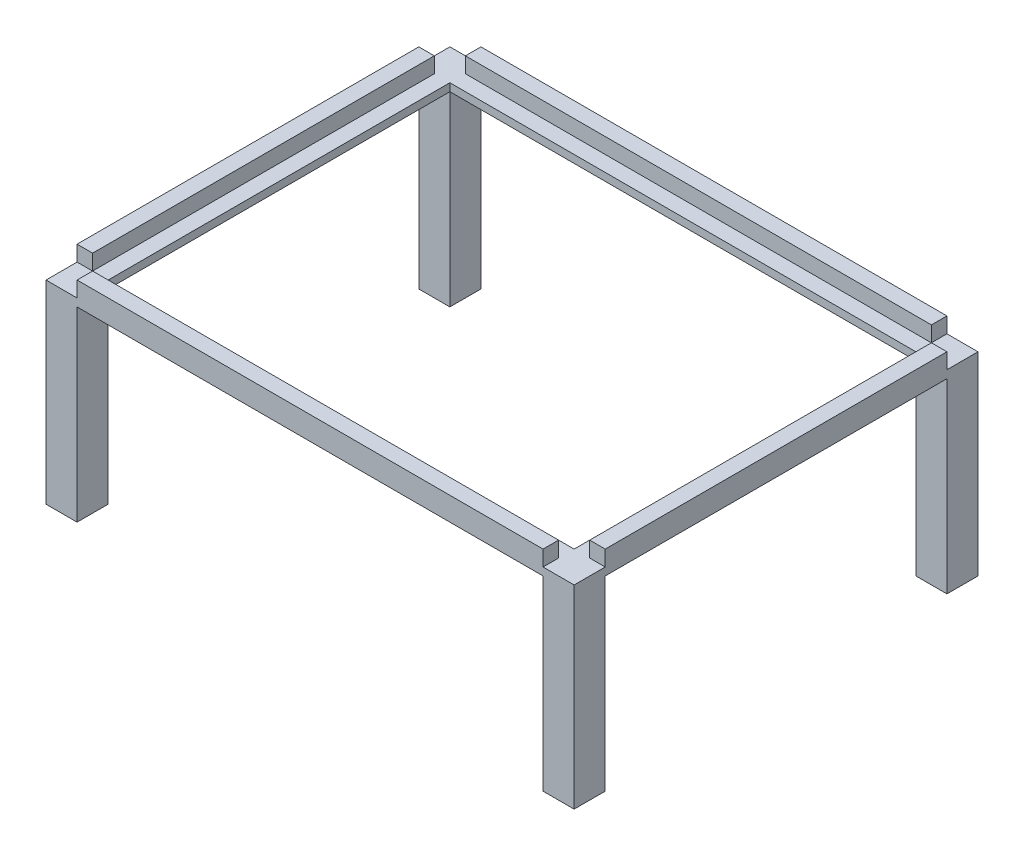
ISO-10303-21;
HEADER;
FILE_DESCRIPTION(('STEP AP214'),'2;1');
FILE_NAME('part.step','',(''),(''),'','','');
FILE_SCHEMA(('AUTOMOTIVE_DESIGN { 1 0 10303 214 1 1 1 1 }'));
ENDSEC;
DATA;
#1=APPLICATION_CONTEXT('core data for automotive mechanical design processes');
#2=APPLICATION_PROTOCOL_DEFINITION('international standard','automotive_design',2000,#1);
#3=PRODUCT_CONTEXT('',#1,'mechanical');
#4=PRODUCT('Part','Part','',(#3));
#5=PRODUCT_RELATED_PRODUCT_CATEGORY('part','',(#4));
#6=PRODUCT_DEFINITION_FORMATION('','',#4);
#7=PRODUCT_DEFINITION_CONTEXT('part definition',#1,'design');
#8=PRODUCT_DEFINITION('design','',#6,#7);
#9=PRODUCT_DEFINITION_SHAPE('','',#8);
#10=(LENGTH_UNIT() NAMED_UNIT(*) SI_UNIT(.MILLI.,.METRE.));
#11=(NAMED_UNIT(*) PLANE_ANGLE_UNIT() SI_UNIT($,.RADIAN.));
#12=(NAMED_UNIT(*) SI_UNIT($,.STERADIAN.) SOLID_ANGLE_UNIT());
#13=UNCERTAINTY_MEASURE_WITH_UNIT(LENGTH_MEASURE(1.E-05),#10,'distance_accuracy_value','');
#14=(GEOMETRIC_REPRESENTATION_CONTEXT(3) GLOBAL_UNCERTAINTY_ASSIGNED_CONTEXT((#13)) GLOBAL_UNIT_ASSIGNED_CONTEXT((#10,
#11,#12)) REPRESENTATION_CONTEXT('',''));
#15=CARTESIAN_POINT('',(0.,0.,0.));
#16=DIRECTION('',(0.,0.,1.));
#17=DIRECTION('',(1.,0.,0.));
#18=AXIS2_PLACEMENT_3D('',#15,#16,#17);
#19=CARTESIAN_POINT('',(0.,6.35,0.));
#20=DIRECTION('',(0.,-1.,0.));
#21=DIRECTION('',(0.,0.,-1.));
#22=AXIS2_PLACEMENT_3D('',#19,#20,#21);
#23=PLANE('',#22);
#24=DIRECTION('',(0.,0.,1.));
#25=VECTOR('',#24,1.);
#26=CARTESIAN_POINT('',(-190.5,6.35,-139.7));
#27=LINE('',#26,#25);
#28=CARTESIAN_POINT('',(-190.5,6.35,-139.7));
#29=VERTEX_POINT('',#28);
#30=CARTESIAN_POINT('',(-190.5,6.35,139.7));
#31=VERTEX_POINT('',#30);
#32=EDGE_CURVE('E470',#29,#31,#27,.T.);
#33=ORIENTED_EDGE('',*,*,#32,.F.);
#34=DIRECTION('',(-1.,0.,0.));
#35=VECTOR('',#34,1.);
#36=CARTESIAN_POINT('',(190.5,6.35,-139.7));
#37=LINE('',#36,#35);
#38=CARTESIAN_POINT('',(190.5,6.35,-139.7));
#39=VERTEX_POINT('',#38);
#40=EDGE_CURVE('E478',#39,#29,#37,.T.);
#41=ORIENTED_EDGE('',*,*,#40,.F.);
#42=DIRECTION('',(0.,0.,-1.));
#43=VECTOR('',#42,1.);
#44=CARTESIAN_POINT('',(190.5,6.35,-139.7));
#45=LINE('',#44,#43);
#46=CARTESIAN_POINT('',(190.5,6.35,139.7));
#47=VERTEX_POINT('',#46);
#48=EDGE_CURVE('E475',#47,#39,#45,.T.);
#49=ORIENTED_EDGE('',*,*,#48,.F.);
#50=DIRECTION('',(1.,0.,0.));
#51=VECTOR('',#50,1.);
#52=CARTESIAN_POINT('',(190.5,6.35,139.7));
#53=LINE('',#52,#51);
#54=EDGE_CURVE('E472',#31,#47,#53,.T.);
#55=ORIENTED_EDGE('',*,*,#54,.F.);
#56=EDGE_LOOP('',(#33,#41,#49,#55));
#57=FACE_BOUND('',#56,.T.);
#58=DIRECTION('',(0.,0.,-1.));
#59=VECTOR('',#58,1.);
#60=CARTESIAN_POINT('',(190.5,6.35,165.1));
#61=LINE('',#60,#59);
#62=CARTESIAN_POINT('',(190.5,6.35,165.1));
#63=VERTEX_POINT('',#62);
#64=CARTESIAN_POINT('',(190.5,6.35,152.4));
#65=VERTEX_POINT('',#64);
#66=EDGE_CURVE('E272',#63,#65,#61,.T.);
#67=ORIENTED_EDGE('',*,*,#66,.F.);
#68=DIRECTION('',(1.,0.,0.));
#69=VECTOR('',#68,1.);
#70=CARTESIAN_POINT('',(215.9,6.35,165.1));
#71=LINE('',#70,#69);
#72=CARTESIAN_POINT('',(215.9,6.35,165.1));
#73=VERTEX_POINT('',#72);
#74=EDGE_CURVE('E505',#63,#73,#71,.T.);
#75=ORIENTED_EDGE('',*,*,#74,.T.);
#76=DIRECTION('',(0.,0.,-1.));
#77=VECTOR('',#76,1.);
#78=CARTESIAN_POINT('',(215.9,6.35,-165.1));
#79=LINE('',#78,#77);
#80=CARTESIAN_POINT('',(215.9,6.35,139.7));
#81=VERTEX_POINT('',#80);
#82=EDGE_CURVE('E510',#73,#81,#79,.T.);
#83=ORIENTED_EDGE('',*,*,#82,.T.);
#84=DIRECTION('',(1.,0.,0.));
#85=VECTOR('',#84,1.);
#86=CARTESIAN_POINT('',(215.9,6.35,139.7));
#87=LINE('',#86,#85);
#88=CARTESIAN_POINT('',(203.2,6.35,139.7));
#89=VERTEX_POINT('',#88);
#90=EDGE_CURVE('E313',#89,#81,#87,.T.);
#91=ORIENTED_EDGE('',*,*,#90,.F.);
#92=DIRECTION('',(0.,0.,1.));
#93=VECTOR('',#92,1.);
#94=CARTESIAN_POINT('',(203.2,6.35,-139.7));
#95=LINE('',#94,#93);
#96=CARTESIAN_POINT('',(203.2,6.35,-139.7));
#97=VERTEX_POINT('',#96);
#98=EDGE_CURVE('E322',#97,#89,#95,.T.);
#99=ORIENTED_EDGE('',*,*,#98,.F.);
#100=DIRECTION('',(-1.,0.,0.));
#101=VECTOR('',#100,1.);
#102=CARTESIAN_POINT('',(215.9,6.35,-139.7));
#103=LINE('',#102,#101);
#104=CARTESIAN_POINT('',(215.9,6.35,-139.7));
#105=VERTEX_POINT('',#104);
#106=EDGE_CURVE('E308',#105,#97,#103,.T.);
#107=ORIENTED_EDGE('',*,*,#106,.F.);
#108=CARTESIAN_POINT('',(215.9,6.35,-165.1));
#109=VERTEX_POINT('',#108);
#110=EDGE_CURVE('E509',#105,#109,#79,.T.);
#111=ORIENTED_EDGE('',*,*,#110,.T.);
#112=DIRECTION('',(-1.,0.,0.));
#113=VECTOR('',#112,1.);
#114=CARTESIAN_POINT('',(215.9,6.35,-165.1));
#115=LINE('',#114,#113);
#116=CARTESIAN_POINT('',(190.5,6.35,-165.1));
#117=VERTEX_POINT('',#116);
#118=EDGE_CURVE('E513',#109,#117,#115,.T.);
#119=ORIENTED_EDGE('',*,*,#118,.T.);
#120=DIRECTION('',(0.,0.,-1.));
#121=VECTOR('',#120,1.);
#122=CARTESIAN_POINT('',(190.5,6.35,-165.1));
#123=LINE('',#122,#121);
#124=CARTESIAN_POINT('',(190.5,6.35,-152.4));
#125=VERTEX_POINT('',#124);
#126=EDGE_CURVE('E286',#125,#117,#123,.T.);
#127=ORIENTED_EDGE('',*,*,#126,.F.);
#128=DIRECTION('',(1.,0.,0.));
#129=VECTOR('',#128,1.);
#130=CARTESIAN_POINT('',(-190.5,6.35,-152.4));
#131=LINE('',#130,#129);
#132=CARTESIAN_POINT('',(-190.5,6.35,-152.4));
#133=VERTEX_POINT('',#132);
#134=EDGE_CURVE('E276',#133,#125,#131,.T.);
#135=ORIENTED_EDGE('',*,*,#134,.F.);
#136=DIRECTION('',(0.,0.,1.));
#137=VECTOR('',#136,1.);
#138=CARTESIAN_POINT('',(-190.5,6.35,-165.1));
#139=LINE('',#138,#137);
#140=CARTESIAN_POINT('',(-190.5,6.35,-165.1));
#141=VERTEX_POINT('',#140);
#142=EDGE_CURVE('E273',#141,#133,#139,.T.);
#143=ORIENTED_EDGE('',*,*,#142,.F.);
#144=CARTESIAN_POINT('',(-215.9,6.35,-165.1));
#145=VERTEX_POINT('',#144);
#146=EDGE_CURVE('E512',#141,#145,#115,.T.);
#147=ORIENTED_EDGE('',*,*,#146,.T.);
#148=DIRECTION('',(0.,0.,1.));
#149=VECTOR('',#148,1.);
#150=CARTESIAN_POINT('',(-215.9,6.35,-165.1));
#151=LINE('',#150,#149);
#152=CARTESIAN_POINT('',(-215.9,6.35,-139.7));
#153=VERTEX_POINT('',#152);
#154=EDGE_CURVE('E503',#145,#153,#151,.T.);
#155=ORIENTED_EDGE('',*,*,#154,.T.);
#156=DIRECTION('',(-1.,0.,0.));
#157=VECTOR('',#156,1.);
#158=CARTESIAN_POINT('',(-203.2,6.35,-139.7));
#159=LINE('',#158,#157);
#160=CARTESIAN_POINT('',(-203.2,6.35,-139.7));
#161=VERTEX_POINT('',#160);
#162=EDGE_CURVE('E352',#161,#153,#159,.T.);
#163=ORIENTED_EDGE('',*,*,#162,.F.);
#164=DIRECTION('',(0.,0.,-1.));
#165=VECTOR('',#164,1.);
#166=CARTESIAN_POINT('',(-203.2,6.35,139.7));
#167=LINE('',#166,#165);
#168=CARTESIAN_POINT('',(-203.2,6.35,139.7));
#169=VERTEX_POINT('',#168);
#170=EDGE_CURVE('E338',#169,#161,#167,.T.);
#171=ORIENTED_EDGE('',*,*,#170,.F.);
#172=DIRECTION('',(1.,0.,0.));
#173=VECTOR('',#172,1.);
#174=CARTESIAN_POINT('',(-203.2,6.35,139.7));
#175=LINE('',#174,#173);
#176=CARTESIAN_POINT('',(-215.9,6.35,139.7));
#177=VERTEX_POINT('',#176);
#178=EDGE_CURVE('E343',#177,#169,#175,.T.);
#179=ORIENTED_EDGE('',*,*,#178,.F.);
#180=CARTESIAN_POINT('',(-215.9,6.35,165.1));
#181=VERTEX_POINT('',#180);
#182=EDGE_CURVE('E506',#177,#181,#151,.T.);
#183=ORIENTED_EDGE('',*,*,#182,.T.);
#184=CARTESIAN_POINT('',(-190.5,6.35,165.1));
#185=VERTEX_POINT('',#184);
#186=EDGE_CURVE('E507',#181,#185,#71,.T.);
#187=ORIENTED_EDGE('',*,*,#186,.T.);
#188=DIRECTION('',(0.,0.,1.));
#189=VECTOR('',#188,1.);
#190=CARTESIAN_POINT('',(-190.5,6.35,165.1));
#191=LINE('',#190,#189);
#192=CARTESIAN_POINT('',(-190.5,6.35,152.4));
#193=VERTEX_POINT('',#192);
#194=EDGE_CURVE('E52',#193,#185,#191,.T.);
#195=ORIENTED_EDGE('',*,*,#194,.F.);
#196=DIRECTION('',(-1.,0.,0.));
#197=VECTOR('',#196,1.);
#198=CARTESIAN_POINT('',(190.5,6.35,152.4));
#199=LINE('',#198,#197);
#200=EDGE_CURVE('E47',#65,#193,#199,.T.);
#201=ORIENTED_EDGE('',*,*,#200,.F.);
#202=EDGE_LOOP('',(#67,#75,#83,#91,#99,#107,#111,#119,#127,#135,#143,#147,#155,#163,#171,#179,
#183,#187,#195,#201));
#203=FACE_BOUND('',#202,.T.);
#204=ADVANCED_FACE('F32',(#57,#203),#23,.F.);
#205=CARTESIAN_POINT('',(0.,0.,0.));
#206=DIRECTION('',(0.,-1.,0.));
#207=DIRECTION('',(0.,0.,-1.));
#208=AXIS2_PLACEMENT_3D('',#205,#206,#207);
#209=PLANE('',#208);
#210=DIRECTION('',(0.,0.,1.));
#211=VECTOR('',#210,1.);
#212=CARTESIAN_POINT('',(190.5,0.,139.7));
#213=LINE('',#212,#211);
#214=CARTESIAN_POINT('',(190.5,0.,139.7));
#215=VERTEX_POINT('',#214);
#216=CARTESIAN_POINT('',(190.5,0.,165.1));
#217=VERTEX_POINT('',#216);
#218=EDGE_CURVE('E368',#215,#217,#213,.T.);
#219=ORIENTED_EDGE('',*,*,#218,.T.);
#220=DIRECTION('',(1.,0.,0.));
#221=VECTOR('',#220,1.);
#222=CARTESIAN_POINT('',(215.9,0.,165.1));
#223=LINE('',#222,#221);
#224=CARTESIAN_POINT('',(-190.5,0.,165.1));
#225=VERTEX_POINT('',#224);
#226=EDGE_CURVE('E517',#225,#217,#223,.T.);
#227=ORIENTED_EDGE('',*,*,#226,.F.);
#228=DIRECTION('',(0.,0.,-1.));
#229=VECTOR('',#228,1.);
#230=CARTESIAN_POINT('',(-190.5,0.,139.7));
#231=LINE('',#230,#229);
#232=CARTESIAN_POINT('',(-190.5,0.,139.7));
#233=VERTEX_POINT('',#232);
#234=EDGE_CURVE('E440',#225,#233,#231,.T.);
#235=ORIENTED_EDGE('',*,*,#234,.T.);
#236=DIRECTION('',(1.,0.,0.));
#237=VECTOR('',#236,1.);
#238=CARTESIAN_POINT('',(190.5,0.,139.7));
#239=LINE('',#238,#237);
#240=EDGE_CURVE('E483',#233,#215,#239,.T.);
#241=ORIENTED_EDGE('',*,*,#240,.T.);
#242=EDGE_LOOP('',(#219,#227,#235,#241));
#243=FACE_BOUND('',#242,.T.);
#244=ADVANCED_FACE('F543',(#243),#209,.T.);
#245=DIRECTION('',(0.,0.,1.));
#246=VECTOR('',#245,1.);
#247=CARTESIAN_POINT('',(190.5,0.,-139.7));
#248=LINE('',#247,#246);
#249=CARTESIAN_POINT('',(190.5,0.,-165.1));
#250=VERTEX_POINT('',#249);
#251=CARTESIAN_POINT('',(190.5,0.,-139.7));
#252=VERTEX_POINT('',#251);
#253=EDGE_CURVE('E389',#250,#252,#248,.T.);
#254=ORIENTED_EDGE('',*,*,#253,.T.);
#255=DIRECTION('',(-1.,0.,0.));
#256=VECTOR('',#255,1.);
#257=CARTESIAN_POINT('',(190.5,0.,-139.7));
#258=LINE('',#257,#256);
#259=CARTESIAN_POINT('',(-190.5,0.,-139.7));
#260=VERTEX_POINT('',#259);
#261=EDGE_CURVE('E473',#252,#260,#258,.T.);
#262=ORIENTED_EDGE('',*,*,#261,.T.);
#263=DIRECTION('',(0.,0.,-1.));
#264=VECTOR('',#263,1.);
#265=CARTESIAN_POINT('',(-190.5,0.,-139.7));
#266=LINE('',#265,#264);
#267=CARTESIAN_POINT('',(-190.5,0.,-165.1));
#268=VERTEX_POINT('',#267);
#269=EDGE_CURVE('E415',#260,#268,#266,.T.);
#270=ORIENTED_EDGE('',*,*,#269,.T.);
#271=DIRECTION('',(-1.,0.,0.));
#272=VECTOR('',#271,1.);
#273=CARTESIAN_POINT('',(215.9,0.,-165.1));
#274=LINE('',#273,#272);
#275=EDGE_CURVE('E522',#250,#268,#274,.T.);
#276=ORIENTED_EDGE('',*,*,#275,.F.);
#277=EDGE_LOOP('',(#254,#262,#270,#276));
#278=FACE_BOUND('',#277,.T.);
#279=ADVANCED_FACE('F571',(#278),#209,.T.);
#280=DIRECTION('',(-1.,0.,0.));
#281=VECTOR('',#280,1.);
#282=CARTESIAN_POINT('',(190.5,0.,139.7));
#283=LINE('',#282,#281);
#284=CARTESIAN_POINT('',(215.9,0.,139.7));
#285=VERTEX_POINT('',#284);
#286=EDGE_CURVE('E373',#285,#215,#283,.T.);
#287=ORIENTED_EDGE('',*,*,#286,.T.);
#288=DIRECTION('',(0.,0.,-1.));
#289=VECTOR('',#288,1.);
#290=CARTESIAN_POINT('',(190.5,0.,-139.7));
#291=LINE('',#290,#289);
#292=EDGE_CURVE('E486',#215,#252,#291,.T.);
#293=ORIENTED_EDGE('',*,*,#292,.T.);
#294=DIRECTION('',(1.,0.,0.));
#295=VECTOR('',#294,1.);
#296=CARTESIAN_POINT('',(190.5,0.,-139.7));
#297=LINE('',#296,#295);
#298=CARTESIAN_POINT('',(215.9,0.,-139.7));
#299=VERTEX_POINT('',#298);
#300=EDGE_CURVE('E398',#252,#299,#297,.T.);
#301=ORIENTED_EDGE('',*,*,#300,.T.);
#302=DIRECTION('',(0.,0.,-1.));
#303=VECTOR('',#302,1.);
#304=CARTESIAN_POINT('',(215.9,0.,-165.1));
#305=LINE('',#304,#303);
#306=EDGE_CURVE('E520',#285,#299,#305,.T.);
#307=ORIENTED_EDGE('',*,*,#306,.F.);
#308=EDGE_LOOP('',(#287,#293,#301,#307));
#309=FACE_BOUND('',#308,.T.);
#310=ADVANCED_FACE('F576',(#309),#209,.T.);
#311=DIRECTION('',(1.,0.,0.));
#312=VECTOR('',#311,1.);
#313=CARTESIAN_POINT('',(-190.5,0.,-139.7));
#314=LINE('',#313,#312);
#315=CARTESIAN_POINT('',(-215.9,0.,-139.7));
#316=VERTEX_POINT('',#315);
#317=EDGE_CURVE('E424',#316,#260,#314,.T.);
#318=ORIENTED_EDGE('',*,*,#317,.T.);
#319=DIRECTION('',(0.,0.,1.));
#320=VECTOR('',#319,1.);
#321=CARTESIAN_POINT('',(-190.5,0.,-139.7));
#322=LINE('',#321,#320);
#323=EDGE_CURVE('E465',#260,#233,#322,.T.);
#324=ORIENTED_EDGE('',*,*,#323,.T.);
#325=DIRECTION('',(-1.,0.,0.));
#326=VECTOR('',#325,1.);
#327=CARTESIAN_POINT('',(-190.5,0.,139.7));
#328=LINE('',#327,#326);
#329=CARTESIAN_POINT('',(-215.9,0.,139.7));
#330=VERTEX_POINT('',#329);
#331=EDGE_CURVE('E449',#233,#330,#328,.T.);
#332=ORIENTED_EDGE('',*,*,#331,.T.);
#333=DIRECTION('',(0.,0.,1.));
#334=VECTOR('',#333,1.);
#335=CARTESIAN_POINT('',(-215.9,0.,-165.1));
#336=LINE('',#335,#334);
#337=EDGE_CURVE('E502',#316,#330,#336,.T.);
#338=ORIENTED_EDGE('',*,*,#337,.F.);
#339=EDGE_LOOP('',(#318,#324,#332,#338));
#340=FACE_BOUND('',#339,.T.);
#341=ADVANCED_FACE('F558',(#340),#209,.T.);
#342=CARTESIAN_POINT('',(-215.9,6.35,-165.1));
#343=DIRECTION('',(1.,0.,0.));
#344=DIRECTION('',(0.,0.,-1.));
#345=AXIS2_PLACEMENT_3D('',#342,#343,#344);
#346=PLANE('',#345);
#347=DIRECTION('',(0.,-1.,0.));
#348=VECTOR('',#347,1.);
#349=CARTESIAN_POINT('',(-215.9,6.35,-165.1));
#350=LINE('',#349,#348);
#351=CARTESIAN_POINT('',(-215.9,-152.4,-165.1));
#352=VERTEX_POINT('',#351);
#353=EDGE_CURVE('E515',#145,#352,#350,.T.);
#354=ORIENTED_EDGE('',*,*,#353,.T.);
#355=DIRECTION('',(0.,0.,1.));
#356=VECTOR('',#355,1.);
#357=CARTESIAN_POINT('',(-215.9,-152.4,-139.7));
#358=LINE('',#357,#356);
#359=CARTESIAN_POINT('',(-215.9,-152.4,-139.7));
#360=VERTEX_POINT('',#359);
#361=EDGE_CURVE('E427',#352,#360,#358,.T.);
#362=ORIENTED_EDGE('',*,*,#361,.T.);
#363=DIRECTION('',(0.,1.,0.));
#364=VECTOR('',#363,1.);
#365=CARTESIAN_POINT('',(-215.9,-152.4,-139.7));
#366=LINE('',#365,#364);
#367=EDGE_CURVE('E441',#360,#316,#366,.T.);
#368=ORIENTED_EDGE('',*,*,#367,.T.);
#369=ORIENTED_EDGE('',*,*,#337,.T.);
#370=DIRECTION('',(0.,1.,0.));
#371=VECTOR('',#370,1.);
#372=CARTESIAN_POINT('',(-215.9,-152.4,139.7));
#373=LINE('',#372,#371);
#374=CARTESIAN_POINT('',(-215.9,-152.4,139.7));
#375=VERTEX_POINT('',#374);
#376=EDGE_CURVE('E466',#375,#330,#373,.T.);
#377=ORIENTED_EDGE('',*,*,#376,.F.);
#378=DIRECTION('',(0.,0.,1.));
#379=VECTOR('',#378,1.);
#380=CARTESIAN_POINT('',(-215.9,-152.4,139.7));
#381=LINE('',#380,#379);
#382=CARTESIAN_POINT('',(-215.9,-152.4,165.1));
#383=VERTEX_POINT('',#382);
#384=EDGE_CURVE('E452',#375,#383,#381,.T.);
#385=ORIENTED_EDGE('',*,*,#384,.T.);
#386=DIRECTION('',(0.,-1.,0.));
#387=VECTOR('',#386,1.);
#388=CARTESIAN_POINT('',(-215.9,6.35,165.1));
#389=LINE('',#388,#387);
#390=EDGE_CURVE('E11',#181,#383,#389,.T.);
#391=ORIENTED_EDGE('',*,*,#390,.F.);
#392=ORIENTED_EDGE('',*,*,#182,.F.);
#393=DIRECTION('',(0.,-1.,0.));
#394=VECTOR('',#393,1.);
#395=CARTESIAN_POINT('',(-215.9,19.05,139.7));
#396=LINE('',#395,#394);
#397=CARTESIAN_POINT('',(-215.9,19.05,139.7));
#398=VERTEX_POINT('',#397);
#399=EDGE_CURVE('E359',#398,#177,#396,.T.);
#400=ORIENTED_EDGE('',*,*,#399,.F.);
#401=DIRECTION('',(0.,0.,1.));
#402=VECTOR('',#401,1.);
#403=CARTESIAN_POINT('',(-215.9,19.05,139.7));
#404=LINE('',#403,#402);
#405=CARTESIAN_POINT('',(-215.9,19.05,-139.7));
#406=VERTEX_POINT('',#405);
#407=EDGE_CURVE('E345',#406,#398,#404,.T.);
#408=ORIENTED_EDGE('',*,*,#407,.F.);
#409=DIRECTION('',(0.,-1.,0.));
#410=VECTOR('',#409,1.);
#411=CARTESIAN_POINT('',(-215.9,19.05,-139.7));
#412=LINE('',#411,#410);
#413=EDGE_CURVE('E362',#406,#153,#412,.T.);
#414=ORIENTED_EDGE('',*,*,#413,.T.);
#415=ORIENTED_EDGE('',*,*,#154,.F.);
#416=EDGE_LOOP('',(#354,#362,#368,#369,#377,#385,#391,#392,#400,#408,#414,#415));
#417=FACE_BOUND('',#416,.T.);
#418=ADVANCED_FACE('F34',(#417),#346,.F.);
#419=CARTESIAN_POINT('',(215.9,6.35,165.1));
#420=DIRECTION('',(0.,0.,-1.));
#421=DIRECTION('',(-1.,0.,0.));
#422=AXIS2_PLACEMENT_3D('',#419,#420,#421);
#423=PLANE('',#422);
#424=ORIENTED_EDGE('',*,*,#390,.T.);
#425=DIRECTION('',(1.,0.,0.));
#426=VECTOR('',#425,1.);
#427=CARTESIAN_POINT('',(-190.5,-152.4,165.1));
#428=LINE('',#427,#426);
#429=CARTESIAN_POINT('',(-190.5,-152.4,165.1));
#430=VERTEX_POINT('',#429);
#431=EDGE_CURVE('E455',#383,#430,#428,.T.);
#432=ORIENTED_EDGE('',*,*,#431,.T.);
#433=DIRECTION('',(0.,1.,0.));
#434=VECTOR('',#433,1.);
#435=CARTESIAN_POINT('',(-190.5,-152.4,165.1));
#436=LINE('',#435,#434);
#437=EDGE_CURVE('E463',#430,#225,#436,.T.);
#438=ORIENTED_EDGE('',*,*,#437,.T.);
#439=ORIENTED_EDGE('',*,*,#226,.T.);
#440=DIRECTION('',(0.,1.,0.));
#441=VECTOR('',#440,1.);
#442=CARTESIAN_POINT('',(190.5,-152.4,165.1));
#443=LINE('',#442,#441);
#444=CARTESIAN_POINT('',(190.5,-152.4,165.1));
#445=VERTEX_POINT('',#444);
#446=EDGE_CURVE('E382',#445,#217,#443,.T.);
#447=ORIENTED_EDGE('',*,*,#446,.F.);
#448=DIRECTION('',(1.,0.,0.));
#449=VECTOR('',#448,1.);
#450=CARTESIAN_POINT('',(190.5,-152.4,165.1));
#451=LINE('',#450,#449);
#452=CARTESIAN_POINT('',(215.9,-152.4,165.1));
#453=VERTEX_POINT('',#452);
#454=EDGE_CURVE('E372',#445,#453,#451,.T.);
#455=ORIENTED_EDGE('',*,*,#454,.T.);
#456=DIRECTION('',(0.,-1.,0.));
#457=VECTOR('',#456,1.);
#458=CARTESIAN_POINT('',(215.9,6.35,165.1));
#459=LINE('',#458,#457);
#460=EDGE_CURVE('E40',#73,#453,#459,.T.);
#461=ORIENTED_EDGE('',*,*,#460,.F.);
#462=ORIENTED_EDGE('',*,*,#74,.F.);
#463=DIRECTION('',(0.,-1.,0.));
#464=VECTOR('',#463,1.);
#465=CARTESIAN_POINT('',(190.5,19.05,165.1));
#466=LINE('',#465,#464);
#467=CARTESIAN_POINT('',(190.5,19.05,165.1));
#468=VERTEX_POINT('',#467);
#469=EDGE_CURVE('E587',#468,#63,#466,.T.);
#470=ORIENTED_EDGE('',*,*,#469,.F.);
#471=DIRECTION('',(1.,0.,0.));
#472=VECTOR('',#471,1.);
#473=CARTESIAN_POINT('',(190.5,19.05,165.1));
#474=LINE('',#473,#472);
#475=CARTESIAN_POINT('',(-190.5,19.05,165.1));
#476=VERTEX_POINT('',#475);
#477=EDGE_CURVE('E266',#476,#468,#474,.T.);
#478=ORIENTED_EDGE('',*,*,#477,.F.);
#479=DIRECTION('',(0.,-1.,0.));
#480=VECTOR('',#479,1.);
#481=CARTESIAN_POINT('',(-190.5,19.05,165.1));
#482=LINE('',#481,#480);
#483=EDGE_CURVE('E278',#476,#185,#482,.T.);
#484=ORIENTED_EDGE('',*,*,#483,.T.);
#485=ORIENTED_EDGE('',*,*,#186,.F.);
#486=EDGE_LOOP('',(#424,#432,#438,#439,#447,#455,#461,#462,#470,#478,#484,#485));
#487=FACE_BOUND('',#486,.T.);
#488=ADVANCED_FACE('F537',(#487),#423,.F.);
#489=CARTESIAN_POINT('',(215.9,6.35,-165.1));
#490=DIRECTION('',(-1.,0.,0.));
#491=DIRECTION('',(0.,0.,1.));
#492=AXIS2_PLACEMENT_3D('',#489,#490,#491);
#493=PLANE('',#492);
#494=ORIENTED_EDGE('',*,*,#460,.T.);
#495=DIRECTION('',(0.,0.,-1.));
#496=VECTOR('',#495,1.);
#497=CARTESIAN_POINT('',(215.9,-152.4,139.7));
#498=LINE('',#497,#496);
#499=CARTESIAN_POINT('',(215.9,-152.4,139.7));
#500=VERTEX_POINT('',#499);
#501=EDGE_CURVE('E376',#453,#500,#498,.T.);
#502=ORIENTED_EDGE('',*,*,#501,.T.);
#503=DIRECTION('',(0.,1.,0.));
#504=VECTOR('',#503,1.);
#505=CARTESIAN_POINT('',(215.9,-152.4,139.7));
#506=LINE('',#505,#504);
#507=EDGE_CURVE('E390',#500,#285,#506,.T.);
#508=ORIENTED_EDGE('',*,*,#507,.T.);
#509=ORIENTED_EDGE('',*,*,#306,.T.);
#510=DIRECTION('',(0.,1.,0.));
#511=VECTOR('',#510,1.);
#512=CARTESIAN_POINT('',(215.9,-152.4,-139.7));
#513=LINE('',#512,#511);
#514=CARTESIAN_POINT('',(215.9,-152.4,-139.7));
#515=VERTEX_POINT('',#514);
#516=EDGE_CURVE('E416',#515,#299,#513,.T.);
#517=ORIENTED_EDGE('',*,*,#516,.F.);
#518=DIRECTION('',(0.,0.,-1.));
#519=VECTOR('',#518,1.);
#520=CARTESIAN_POINT('',(215.9,-152.4,-139.7));
#521=LINE('',#520,#519);
#522=CARTESIAN_POINT('',(215.9,-152.4,-165.1));
#523=VERTEX_POINT('',#522);
#524=EDGE_CURVE('E401',#515,#523,#521,.T.);
#525=ORIENTED_EDGE('',*,*,#524,.T.);
#526=DIRECTION('',(0.,-1.,0.));
#527=VECTOR('',#526,1.);
#528=CARTESIAN_POINT('',(215.9,6.35,-165.1));
#529=LINE('',#528,#527);
#530=EDGE_CURVE('E525',#109,#523,#529,.T.);
#531=ORIENTED_EDGE('',*,*,#530,.F.);
#532=ORIENTED_EDGE('',*,*,#110,.F.);
#533=DIRECTION('',(0.,-1.,0.));
#534=VECTOR('',#533,1.);
#535=CARTESIAN_POINT('',(215.9,19.05,-139.7));
#536=LINE('',#535,#534);
#537=CARTESIAN_POINT('',(215.9,19.05,-139.7));
#538=VERTEX_POINT('',#537);
#539=EDGE_CURVE('E335',#538,#105,#536,.T.);
#540=ORIENTED_EDGE('',*,*,#539,.F.);
#541=DIRECTION('',(0.,0.,-1.));
#542=VECTOR('',#541,1.);
#543=CARTESIAN_POINT('',(215.9,19.05,-139.7));
#544=LINE('',#543,#542);
#545=CARTESIAN_POINT('',(215.9,19.05,139.7));
#546=VERTEX_POINT('',#545);
#547=EDGE_CURVE('E309',#546,#538,#544,.T.);
#548=ORIENTED_EDGE('',*,*,#547,.F.);
#549=DIRECTION('',(0.,-1.,0.));
#550=VECTOR('',#549,1.);
#551=CARTESIAN_POINT('',(215.9,19.05,139.7));
#552=LINE('',#551,#550);
#553=EDGE_CURVE('E319',#546,#81,#552,.T.);
#554=ORIENTED_EDGE('',*,*,#553,.T.);
#555=ORIENTED_EDGE('',*,*,#82,.F.);
#556=EDGE_LOOP('',(#494,#502,#508,#509,#517,#525,#531,#532,#540,#548,#554,#555));
#557=FACE_BOUND('',#556,.T.);
#558=ADVANCED_FACE('F530',(#557),#493,.F.);
#559=CARTESIAN_POINT('',(215.9,6.35,-165.1));
#560=DIRECTION('',(0.,0.,1.));
#561=DIRECTION('',(1.,0.,0.));
#562=AXIS2_PLACEMENT_3D('',#559,#560,#561);
#563=PLANE('',#562);
#564=ORIENTED_EDGE('',*,*,#530,.T.);
#565=DIRECTION('',(-1.,0.,0.));
#566=VECTOR('',#565,1.);
#567=CARTESIAN_POINT('',(190.5,-152.4,-165.1));
#568=LINE('',#567,#566);
#569=CARTESIAN_POINT('',(190.5,-152.4,-165.1));
#570=VERTEX_POINT('',#569);
#571=EDGE_CURVE('E404',#523,#570,#568,.T.);
#572=ORIENTED_EDGE('',*,*,#571,.T.);
#573=DIRECTION('',(0.,1.,0.));
#574=VECTOR('',#573,1.);
#575=CARTESIAN_POINT('',(190.5,-152.4,-165.1));
#576=LINE('',#575,#574);
#577=EDGE_CURVE('E412',#570,#250,#576,.T.);
#578=ORIENTED_EDGE('',*,*,#577,.T.);
#579=ORIENTED_EDGE('',*,*,#275,.T.);
#580=DIRECTION('',(0.,1.,0.));
#581=VECTOR('',#580,1.);
#582=CARTESIAN_POINT('',(-190.5,-152.4,-165.1));
#583=LINE('',#582,#581);
#584=CARTESIAN_POINT('',(-190.5,-152.4,-165.1));
#585=VERTEX_POINT('',#584);
#586=EDGE_CURVE('E433',#585,#268,#583,.T.);
#587=ORIENTED_EDGE('',*,*,#586,.F.);
#588=DIRECTION('',(-1.,0.,0.));
#589=VECTOR('',#588,1.);
#590=CARTESIAN_POINT('',(-190.5,-152.4,-165.1));
#591=LINE('',#590,#589);
#592=EDGE_CURVE('E423',#585,#352,#591,.T.);
#593=ORIENTED_EDGE('',*,*,#592,.T.);
#594=ORIENTED_EDGE('',*,*,#353,.F.);
#595=ORIENTED_EDGE('',*,*,#146,.F.);
#596=DIRECTION('',(0.,-1.,0.));
#597=VECTOR('',#596,1.);
#598=CARTESIAN_POINT('',(-190.5,19.05,-165.1));
#599=LINE('',#598,#597);
#600=CARTESIAN_POINT('',(-190.5,19.05,-165.1));
#601=VERTEX_POINT('',#600);
#602=EDGE_CURVE('E291',#601,#141,#599,.T.);
#603=ORIENTED_EDGE('',*,*,#602,.F.);
#604=DIRECTION('',(-1.,0.,0.));
#605=VECTOR('',#604,1.);
#606=CARTESIAN_POINT('',(-190.5,19.05,-165.1));
#607=LINE('',#606,#605);
#608=CARTESIAN_POINT('',(190.5,19.05,-165.1));
#609=VERTEX_POINT('',#608);
#610=EDGE_CURVE('E290',#609,#601,#607,.T.);
#611=ORIENTED_EDGE('',*,*,#610,.F.);
#612=DIRECTION('',(0.,-1.,0.));
#613=VECTOR('',#612,1.);
#614=CARTESIAN_POINT('',(190.5,19.05,-165.1));
#615=LINE('',#614,#613);
#616=EDGE_CURVE('E299',#609,#117,#615,.T.);
#617=ORIENTED_EDGE('',*,*,#616,.T.);
#618=ORIENTED_EDGE('',*,*,#118,.F.);
#619=EDGE_LOOP('',(#564,#572,#578,#579,#587,#593,#594,#595,#603,#611,#617,#618));
#620=FACE_BOUND('',#619,.T.);
#621=ADVANCED_FACE('F629',(#620),#563,.F.);
#622=CARTESIAN_POINT('',(-190.5,6.35,-139.7));
#623=DIRECTION('',(1.,0.,0.));
#624=DIRECTION('',(0.,0.,-1.));
#625=AXIS2_PLACEMENT_3D('',#622,#623,#624);
#626=PLANE('',#625);
#627=ORIENTED_EDGE('',*,*,#323,.F.);
#628=DIRECTION('',(0.,-1.,0.));
#629=VECTOR('',#628,1.);
#630=CARTESIAN_POINT('',(-190.5,6.35,-139.7));
#631=LINE('',#630,#629);
#632=EDGE_CURVE('E480',#29,#260,#631,.T.);
#633=ORIENTED_EDGE('',*,*,#632,.F.);
#634=ORIENTED_EDGE('',*,*,#32,.T.);
#635=DIRECTION('',(0.,-1.,0.));
#636=VECTOR('',#635,1.);
#637=CARTESIAN_POINT('',(-190.5,6.35,139.7));
#638=LINE('',#637,#636);
#639=EDGE_CURVE('E499',#31,#233,#638,.T.);
#640=ORIENTED_EDGE('',*,*,#639,.T.);
#641=EDGE_LOOP('',(#627,#633,#634,#640));
#642=FACE_BOUND('',#641,.T.);
#643=ADVANCED_FACE('F554',(#642),#626,.T.);
#644=CARTESIAN_POINT('',(190.5,6.35,139.7));
#645=DIRECTION('',(0.,0.,-1.));
#646=DIRECTION('',(-1.,0.,0.));
#647=AXIS2_PLACEMENT_3D('',#644,#645,#646);
#648=PLANE('',#647);
#649=ORIENTED_EDGE('',*,*,#240,.F.);
#650=ORIENTED_EDGE('',*,*,#639,.F.);
#651=ORIENTED_EDGE('',*,*,#54,.T.);
#652=DIRECTION('',(0.,-1.,0.));
#653=VECTOR('',#652,1.);
#654=CARTESIAN_POINT('',(190.5,6.35,139.7));
#655=LINE('',#654,#653);
#656=EDGE_CURVE('E496',#47,#215,#655,.T.);
#657=ORIENTED_EDGE('',*,*,#656,.T.);
#658=EDGE_LOOP('',(#649,#650,#651,#657));
#659=FACE_BOUND('',#658,.T.);
#660=ADVANCED_FACE('F548',(#659),#648,.T.);
#661=CARTESIAN_POINT('',(190.5,6.35,-139.7));
#662=DIRECTION('',(-1.,0.,0.));
#663=DIRECTION('',(0.,0.,1.));
#664=AXIS2_PLACEMENT_3D('',#661,#662,#663);
#665=PLANE('',#664);
#666=ORIENTED_EDGE('',*,*,#292,.F.);
#667=ORIENTED_EDGE('',*,*,#656,.F.);
#668=ORIENTED_EDGE('',*,*,#48,.T.);
#669=DIRECTION('',(0.,-1.,0.));
#670=VECTOR('',#669,1.);
#671=CARTESIAN_POINT('',(190.5,6.35,-139.7));
#672=LINE('',#671,#670);
#673=EDGE_CURVE('E493',#39,#252,#672,.T.);
#674=ORIENTED_EDGE('',*,*,#673,.T.);
#675=EDGE_LOOP('',(#666,#667,#668,#674));
#676=FACE_BOUND('',#675,.T.);
#677=ADVANCED_FACE('F580',(#676),#665,.T.);
#678=CARTESIAN_POINT('',(190.5,6.35,-139.7));
#679=DIRECTION('',(0.,0.,1.));
#680=DIRECTION('',(1.,0.,0.));
#681=AXIS2_PLACEMENT_3D('',#678,#679,#680);
#682=PLANE('',#681);
#683=ORIENTED_EDGE('',*,*,#261,.F.);
#684=ORIENTED_EDGE('',*,*,#673,.F.);
#685=ORIENTED_EDGE('',*,*,#40,.T.);
#686=ORIENTED_EDGE('',*,*,#632,.T.);
#687=EDGE_LOOP('',(#683,#684,#685,#686));
#688=FACE_BOUND('',#687,.T.);
#689=ADVANCED_FACE('F574',(#688),#682,.T.);
#690=CARTESIAN_POINT('',(-190.5,-152.4,139.7));
#691=DIRECTION('',(1.,0.,0.));
#692=DIRECTION('',(0.,0.,-1.));
#693=AXIS2_PLACEMENT_3D('',#690,#691,#692);
#694=PLANE('',#693);
#695=ORIENTED_EDGE('',*,*,#234,.F.);
#696=ORIENTED_EDGE('',*,*,#437,.F.);
#697=DIRECTION('',(0.,0.,-1.));
#698=VECTOR('',#697,1.);
#699=CARTESIAN_POINT('',(-190.5,-152.4,139.7));
#700=LINE('',#699,#698);
#701=CARTESIAN_POINT('',(-190.5,-152.4,139.7));
#702=VERTEX_POINT('',#701);
#703=EDGE_CURVE('E445',#430,#702,#700,.T.);
#704=ORIENTED_EDGE('',*,*,#703,.T.);
#705=DIRECTION('',(0.,1.,0.));
#706=VECTOR('',#705,1.);
#707=CARTESIAN_POINT('',(-190.5,-152.4,139.7));
#708=LINE('',#707,#706);
#709=EDGE_CURVE('E458',#702,#233,#708,.T.);
#710=ORIENTED_EDGE('',*,*,#709,.T.);
#711=EDGE_LOOP('',(#695,#696,#704,#710));
#712=FACE_BOUND('',#711,.T.);
#713=ADVANCED_FACE('F609',(#712),#694,.T.);
#714=CARTESIAN_POINT('',(-190.5,-152.4,139.7));
#715=DIRECTION('',(0.,0.,-1.));
#716=DIRECTION('',(-1.,0.,0.));
#717=AXIS2_PLACEMENT_3D('',#714,#715,#716);
#718=PLANE('',#717);
#719=ORIENTED_EDGE('',*,*,#331,.F.);
#720=ORIENTED_EDGE('',*,*,#709,.F.);
#721=DIRECTION('',(-1.,0.,0.));
#722=VECTOR('',#721,1.);
#723=CARTESIAN_POINT('',(-190.5,-152.4,139.7));
#724=LINE('',#723,#722);
#725=EDGE_CURVE('E448',#702,#375,#724,.T.);
#726=ORIENTED_EDGE('',*,*,#725,.T.);
#727=ORIENTED_EDGE('',*,*,#376,.T.);
#728=EDGE_LOOP('',(#719,#720,#726,#727));
#729=FACE_BOUND('',#728,.T.);
#730=ADVANCED_FACE('F611',(#729),#718,.T.);
#731=CARTESIAN_POINT('',(0.,-152.4,0.));
#732=DIRECTION('',(0.,-1.,0.));
#733=DIRECTION('',(0.,0.,-1.));
#734=AXIS2_PLACEMENT_3D('',#731,#732,#733);
#735=PLANE('',#734);
#736=ORIENTED_EDGE('',*,*,#703,.F.);
#737=ORIENTED_EDGE('',*,*,#431,.F.);
#738=ORIENTED_EDGE('',*,*,#384,.F.);
#739=ORIENTED_EDGE('',*,*,#725,.F.);
#740=EDGE_LOOP('',(#736,#737,#738,#739));
#741=FACE_BOUND('',#740,.T.);
#742=ADVANCED_FACE('F607',(#741),#735,.T.);
#743=CARTESIAN_POINT('',(-190.5,-152.4,-139.7));
#744=DIRECTION('',(1.,0.,0.));
#745=DIRECTION('',(0.,0.,-1.));
#746=AXIS2_PLACEMENT_3D('',#743,#744,#745);
#747=PLANE('',#746);
#748=ORIENTED_EDGE('',*,*,#269,.F.);
#749=DIRECTION('',(0.,1.,0.));
#750=VECTOR('',#749,1.);
#751=CARTESIAN_POINT('',(-190.5,-152.4,-139.7));
#752=LINE('',#751,#750);
#753=CARTESIAN_POINT('',(-190.5,-152.4,-139.7));
#754=VERTEX_POINT('',#753);
#755=EDGE_CURVE('E438',#754,#260,#752,.T.);
#756=ORIENTED_EDGE('',*,*,#755,.F.);
#757=DIRECTION('',(0.,0.,-1.));
#758=VECTOR('',#757,1.);
#759=CARTESIAN_POINT('',(-190.5,-152.4,-139.7));
#760=LINE('',#759,#758);
#761=EDGE_CURVE('E420',#754,#585,#760,.T.);
#762=ORIENTED_EDGE('',*,*,#761,.T.);
#763=ORIENTED_EDGE('',*,*,#586,.T.);
#764=EDGE_LOOP('',(#748,#756,#762,#763));
#765=FACE_BOUND('',#764,.T.);
#766=ADVANCED_FACE('F568',(#765),#747,.T.);
#767=CARTESIAN_POINT('',(-190.5,-152.4,-139.7));
#768=DIRECTION('',(0.,0.,1.));
#769=DIRECTION('',(1.,0.,0.));
#770=AXIS2_PLACEMENT_3D('',#767,#768,#769);
#771=PLANE('',#770);
#772=ORIENTED_EDGE('',*,*,#317,.F.);
#773=ORIENTED_EDGE('',*,*,#367,.F.);
#774=DIRECTION('',(1.,0.,0.));
#775=VECTOR('',#774,1.);
#776=CARTESIAN_POINT('',(-190.5,-152.4,-139.7));
#777=LINE('',#776,#775);
#778=EDGE_CURVE('E430',#360,#754,#777,.T.);
#779=ORIENTED_EDGE('',*,*,#778,.T.);
#780=ORIENTED_EDGE('',*,*,#755,.T.);
#781=EDGE_LOOP('',(#772,#773,#779,#780));
#782=FACE_BOUND('',#781,.T.);
#783=ADVANCED_FACE('F563',(#782),#771,.T.);
#784=CARTESIAN_POINT('',(0.,-152.4,0.));
#785=DIRECTION('',(0.,1.,0.));
#786=DIRECTION('',(0.,0.,1.));
#787=AXIS2_PLACEMENT_3D('',#784,#785,#786);
#788=PLANE('',#787);
#789=ORIENTED_EDGE('',*,*,#761,.F.);
#790=ORIENTED_EDGE('',*,*,#778,.F.);
#791=ORIENTED_EDGE('',*,*,#361,.F.);
#792=ORIENTED_EDGE('',*,*,#592,.F.);
#793=EDGE_LOOP('',(#789,#790,#791,#792));
#794=FACE_BOUND('',#793,.T.);
#795=ADVANCED_FACE('F725',(#794),#788,.F.);
#796=CARTESIAN_POINT('',(190.5,-152.4,-139.7));
#797=DIRECTION('',(-1.,0.,0.));
#798=DIRECTION('',(0.,0.,1.));
#799=AXIS2_PLACEMENT_3D('',#796,#797,#798);
#800=PLANE('',#799);
#801=ORIENTED_EDGE('',*,*,#253,.F.);
#802=ORIENTED_EDGE('',*,*,#577,.F.);
#803=DIRECTION('',(0.,0.,1.));
#804=VECTOR('',#803,1.);
#805=CARTESIAN_POINT('',(190.5,-152.4,-139.7));
#806=LINE('',#805,#804);
#807=CARTESIAN_POINT('',(190.5,-152.4,-139.7));
#808=VERTEX_POINT('',#807);
#809=EDGE_CURVE('E394',#570,#808,#806,.T.);
#810=ORIENTED_EDGE('',*,*,#809,.T.);
#811=DIRECTION('',(0.,1.,0.));
#812=VECTOR('',#811,1.);
#813=CARTESIAN_POINT('',(190.5,-152.4,-139.7));
#814=LINE('',#813,#812);
#815=EDGE_CURVE('E407',#808,#252,#814,.T.);
#816=ORIENTED_EDGE('',*,*,#815,.T.);
#817=EDGE_LOOP('',(#801,#802,#810,#816));
#818=FACE_BOUND('',#817,.T.);
#819=ADVANCED_FACE('F715',(#818),#800,.T.);
#820=CARTESIAN_POINT('',(190.5,-152.4,-139.7));
#821=DIRECTION('',(0.,0.,1.));
#822=DIRECTION('',(1.,0.,0.));
#823=AXIS2_PLACEMENT_3D('',#820,#821,#822);
#824=PLANE('',#823);
#825=ORIENTED_EDGE('',*,*,#300,.F.);
#826=ORIENTED_EDGE('',*,*,#815,.F.);
#827=DIRECTION('',(1.,0.,0.));
#828=VECTOR('',#827,1.);
#829=CARTESIAN_POINT('',(190.5,-152.4,-139.7));
#830=LINE('',#829,#828);
#831=EDGE_CURVE('E397',#808,#515,#830,.T.);
#832=ORIENTED_EDGE('',*,*,#831,.T.);
#833=ORIENTED_EDGE('',*,*,#516,.T.);
#834=EDGE_LOOP('',(#825,#826,#832,#833));
#835=FACE_BOUND('',#834,.T.);
#836=ADVANCED_FACE('F705',(#835),#824,.T.);
#837=CARTESIAN_POINT('',(0.,-152.4,0.));
#838=DIRECTION('',(0.,-1.,0.));
#839=DIRECTION('',(0.,0.,-1.));
#840=AXIS2_PLACEMENT_3D('',#837,#838,#839);
#841=PLANE('',#840);
#842=ORIENTED_EDGE('',*,*,#809,.F.);
#843=ORIENTED_EDGE('',*,*,#571,.F.);
#844=ORIENTED_EDGE('',*,*,#524,.F.);
#845=ORIENTED_EDGE('',*,*,#831,.F.);
#846=EDGE_LOOP('',(#842,#843,#844,#845));
#847=FACE_BOUND('',#846,.T.);
#848=ADVANCED_FACE('F696',(#847),#841,.T.);
#849=CARTESIAN_POINT('',(190.5,-152.4,139.7));
#850=DIRECTION('',(-1.,0.,0.));
#851=DIRECTION('',(0.,0.,1.));
#852=AXIS2_PLACEMENT_3D('',#849,#850,#851);
#853=PLANE('',#852);
#854=ORIENTED_EDGE('',*,*,#218,.F.);
#855=DIRECTION('',(0.,1.,0.));
#856=VECTOR('',#855,1.);
#857=CARTESIAN_POINT('',(190.5,-152.4,139.7));
#858=LINE('',#857,#856);
#859=CARTESIAN_POINT('',(190.5,-152.4,139.7));
#860=VERTEX_POINT('',#859);
#861=EDGE_CURVE('E387',#860,#215,#858,.T.);
#862=ORIENTED_EDGE('',*,*,#861,.F.);
#863=DIRECTION('',(0.,0.,1.));
#864=VECTOR('',#863,1.);
#865=CARTESIAN_POINT('',(190.5,-152.4,139.7));
#866=LINE('',#865,#864);
#867=EDGE_CURVE('E369',#860,#445,#866,.T.);
#868=ORIENTED_EDGE('',*,*,#867,.T.);
#869=ORIENTED_EDGE('',*,*,#446,.T.);
#870=EDGE_LOOP('',(#854,#862,#868,#869));
#871=FACE_BOUND('',#870,.T.);
#872=ADVANCED_FACE('F541',(#871),#853,.T.);
#873=CARTESIAN_POINT('',(190.5,-152.4,139.7));
#874=DIRECTION('',(0.,0.,-1.));
#875=DIRECTION('',(-1.,0.,0.));
#876=AXIS2_PLACEMENT_3D('',#873,#874,#875);
#877=PLANE('',#876);
#878=ORIENTED_EDGE('',*,*,#286,.F.);
#879=ORIENTED_EDGE('',*,*,#507,.F.);
#880=DIRECTION('',(-1.,0.,0.));
#881=VECTOR('',#880,1.);
#882=CARTESIAN_POINT('',(190.5,-152.4,139.7));
#883=LINE('',#882,#881);
#884=EDGE_CURVE('E379',#500,#860,#883,.T.);
#885=ORIENTED_EDGE('',*,*,#884,.T.);
#886=ORIENTED_EDGE('',*,*,#861,.T.);
#887=EDGE_LOOP('',(#878,#879,#885,#886));
#888=FACE_BOUND('',#887,.T.);
#889=ADVANCED_FACE('F677',(#888),#877,.T.);
#890=CARTESIAN_POINT('',(0.,-152.4,0.));
#891=DIRECTION('',(0.,1.,0.));
#892=DIRECTION('',(0.,0.,1.));
#893=AXIS2_PLACEMENT_3D('',#890,#891,#892);
#894=PLANE('',#893);
#895=ORIENTED_EDGE('',*,*,#867,.F.);
#896=ORIENTED_EDGE('',*,*,#884,.F.);
#897=ORIENTED_EDGE('',*,*,#501,.F.);
#898=ORIENTED_EDGE('',*,*,#454,.F.);
#899=EDGE_LOOP('',(#895,#896,#897,#898));
#900=FACE_BOUND('',#899,.T.);
#901=ADVANCED_FACE('F536',(#900),#894,.F.);
#902=CARTESIAN_POINT('',(-203.2,19.05,139.7));
#903=DIRECTION('',(-1.,0.,0.));
#904=DIRECTION('',(0.,0.,1.));
#905=AXIS2_PLACEMENT_3D('',#902,#903,#904);
#906=PLANE('',#905);
#907=ORIENTED_EDGE('',*,*,#170,.T.);
#908=DIRECTION('',(0.,-1.,0.));
#909=VECTOR('',#908,1.);
#910=CARTESIAN_POINT('',(-203.2,19.05,-139.7));
#911=LINE('',#910,#909);
#912=CARTESIAN_POINT('',(-203.2,19.05,-139.7));
#913=VERTEX_POINT('',#912);
#914=EDGE_CURVE('E365',#913,#161,#911,.T.);
#915=ORIENTED_EDGE('',*,*,#914,.F.);
#916=DIRECTION('',(0.,0.,-1.));
#917=VECTOR('',#916,1.);
#918=CARTESIAN_POINT('',(-203.2,19.05,139.7));
#919=LINE('',#918,#917);
#920=CARTESIAN_POINT('',(-203.2,19.05,139.7));
#921=VERTEX_POINT('',#920);
#922=EDGE_CURVE('E339',#921,#913,#919,.T.);
#923=ORIENTED_EDGE('',*,*,#922,.F.);
#924=DIRECTION('',(0.,-1.,0.));
#925=VECTOR('',#924,1.);
#926=CARTESIAN_POINT('',(-203.2,19.05,139.7));
#927=LINE('',#926,#925);
#928=EDGE_CURVE('E349',#921,#169,#927,.T.);
#929=ORIENTED_EDGE('',*,*,#928,.T.);
#930=EDGE_LOOP('',(#907,#915,#923,#929));
#931=FACE_BOUND('',#930,.T.);
#932=ADVANCED_FACE('F676',(#931),#906,.F.);
#933=CARTESIAN_POINT('',(-203.2,19.05,-139.7));
#934=DIRECTION('',(0.,0.,1.));
#935=DIRECTION('',(1.,0.,0.));
#936=AXIS2_PLACEMENT_3D('',#933,#934,#935);
#937=PLANE('',#936);
#938=ORIENTED_EDGE('',*,*,#162,.T.);
#939=ORIENTED_EDGE('',*,*,#413,.F.);
#940=DIRECTION('',(-1.,0.,0.));
#941=VECTOR('',#940,1.);
#942=CARTESIAN_POINT('',(-203.2,19.05,-139.7));
#943=LINE('',#942,#941);
#944=EDGE_CURVE('E342',#913,#406,#943,.T.);
#945=ORIENTED_EDGE('',*,*,#944,.F.);
#946=ORIENTED_EDGE('',*,*,#914,.T.);
#947=EDGE_LOOP('',(#938,#939,#945,#946));
#948=FACE_BOUND('',#947,.T.);
#949=ADVANCED_FACE('F852',(#948),#937,.F.);
#950=CARTESIAN_POINT('',(-203.2,19.05,139.7));
#951=DIRECTION('',(0.,0.,-1.));
#952=DIRECTION('',(-1.,0.,0.));
#953=AXIS2_PLACEMENT_3D('',#950,#951,#952);
#954=PLANE('',#953);
#955=ORIENTED_EDGE('',*,*,#178,.T.);
#956=ORIENTED_EDGE('',*,*,#928,.F.);
#957=DIRECTION('',(1.,0.,0.));
#958=VECTOR('',#957,1.);
#959=CARTESIAN_POINT('',(-203.2,19.05,139.7));
#960=LINE('',#959,#958);
#961=EDGE_CURVE('E347',#398,#921,#960,.T.);
#962=ORIENTED_EDGE('',*,*,#961,.F.);
#963=ORIENTED_EDGE('',*,*,#399,.T.);
#964=EDGE_LOOP('',(#955,#956,#962,#963));
#965=FACE_BOUND('',#964,.T.);
#966=ADVANCED_FACE('F861',(#965),#954,.F.);
#967=CARTESIAN_POINT('',(0.,19.05,0.));
#968=DIRECTION('',(0.,1.,0.));
#969=DIRECTION('',(0.,0.,1.));
#970=AXIS2_PLACEMENT_3D('',#967,#968,#969);
#971=PLANE('',#970);
#972=ORIENTED_EDGE('',*,*,#922,.T.);
#973=ORIENTED_EDGE('',*,*,#944,.T.);
#974=ORIENTED_EDGE('',*,*,#407,.T.);
#975=ORIENTED_EDGE('',*,*,#961,.T.);
#976=EDGE_LOOP('',(#972,#973,#974,#975));
#977=FACE_BOUND('',#976,.T.);
#978=ADVANCED_FACE('F870',(#977),#971,.T.);
#979=CARTESIAN_POINT('',(215.9,19.05,-139.7));
#980=DIRECTION('',(0.,0.,1.));
#981=DIRECTION('',(1.,0.,0.));
#982=AXIS2_PLACEMENT_3D('',#979,#980,#981);
#983=PLANE('',#982);
#984=ORIENTED_EDGE('',*,*,#106,.T.);
#985=DIRECTION('',(0.,-1.,0.));
#986=VECTOR('',#985,1.);
#987=CARTESIAN_POINT('',(203.2,19.05,-139.7));
#988=LINE('',#987,#986);
#989=CARTESIAN_POINT('',(203.2,19.05,-139.7));
#990=VERTEX_POINT('',#989);
#991=EDGE_CURVE('E332',#990,#97,#988,.T.);
#992=ORIENTED_EDGE('',*,*,#991,.F.);
#993=DIRECTION('',(-1.,0.,0.));
#994=VECTOR('',#993,1.);
#995=CARTESIAN_POINT('',(215.9,19.05,-139.7));
#996=LINE('',#995,#994);
#997=EDGE_CURVE('E312',#538,#990,#996,.T.);
#998=ORIENTED_EDGE('',*,*,#997,.F.);
#999=ORIENTED_EDGE('',*,*,#539,.T.);
#1000=EDGE_LOOP('',(#984,#992,#998,#999));
#1001=FACE_BOUND('',#1000,.T.);
#1002=ADVANCED_FACE('F879',(#1001),#983,.F.);
#1003=CARTESIAN_POINT('',(203.2,19.05,-139.7));
#1004=DIRECTION('',(1.,0.,0.));
#1005=DIRECTION('',(0.,0.,-1.));
#1006=AXIS2_PLACEMENT_3D('',#1003,#1004,#1005);
#1007=PLANE('',#1006);
#1008=ORIENTED_EDGE('',*,*,#98,.T.);
#1009=DIRECTION('',(0.,-1.,0.));
#1010=VECTOR('',#1009,1.);
#1011=CARTESIAN_POINT('',(203.2,19.05,139.7));
#1012=LINE('',#1011,#1010);
#1013=CARTESIAN_POINT('',(203.2,19.05,139.7));
#1014=VERTEX_POINT('',#1013);
#1015=EDGE_CURVE('E329',#1014,#89,#1012,.T.);
#1016=ORIENTED_EDGE('',*,*,#1015,.F.);
#1017=DIRECTION('',(0.,0.,1.));
#1018=VECTOR('',#1017,1.);
#1019=CARTESIAN_POINT('',(203.2,19.05,-139.7));
#1020=LINE('',#1019,#1018);
#1021=EDGE_CURVE('E315',#990,#1014,#1020,.T.);
#1022=ORIENTED_EDGE('',*,*,#1021,.F.);
#1023=ORIENTED_EDGE('',*,*,#991,.T.);
#1024=EDGE_LOOP('',(#1008,#1016,#1022,#1023));
#1025=FACE_BOUND('',#1024,.T.);
#1026=ADVANCED_FACE('F888',(#1025),#1007,.F.);
#1027=CARTESIAN_POINT('',(215.9,19.05,139.7));
#1028=DIRECTION('',(0.,0.,-1.));
#1029=DIRECTION('',(-1.,0.,0.));
#1030=AXIS2_PLACEMENT_3D('',#1027,#1028,#1029);
#1031=PLANE('',#1030);
#1032=ORIENTED_EDGE('',*,*,#90,.T.);
#1033=ORIENTED_EDGE('',*,*,#553,.F.);
#1034=DIRECTION('',(1.,0.,0.));
#1035=VECTOR('',#1034,1.);
#1036=CARTESIAN_POINT('',(215.9,19.05,139.7));
#1037=LINE('',#1036,#1035);
#1038=EDGE_CURVE('E317',#1014,#546,#1037,.T.);
#1039=ORIENTED_EDGE('',*,*,#1038,.F.);
#1040=ORIENTED_EDGE('',*,*,#1015,.T.);
#1041=EDGE_LOOP('',(#1032,#1033,#1039,#1040));
#1042=FACE_BOUND('',#1041,.T.);
#1043=ADVANCED_FACE('F897',(#1042),#1031,.F.);
#1044=CARTESIAN_POINT('',(0.,19.05,0.));
#1045=DIRECTION('',(0.,-1.,0.));
#1046=DIRECTION('',(0.,0.,-1.));
#1047=AXIS2_PLACEMENT_3D('',#1044,#1045,#1046);
#1048=PLANE('',#1047);
#1049=ORIENTED_EDGE('',*,*,#547,.T.);
#1050=ORIENTED_EDGE('',*,*,#997,.T.);
#1051=ORIENTED_EDGE('',*,*,#1021,.T.);
#1052=ORIENTED_EDGE('',*,*,#1038,.T.);
#1053=EDGE_LOOP('',(#1049,#1050,#1051,#1052));
#1054=FACE_BOUND('',#1053,.T.);
#1055=ADVANCED_FACE('F906',(#1054),#1048,.F.);
#1056=CARTESIAN_POINT('',(-190.5,19.05,-165.1));
#1057=DIRECTION('',(1.,0.,0.));
#1058=DIRECTION('',(0.,0.,-1.));
#1059=AXIS2_PLACEMENT_3D('',#1056,#1057,#1058);
#1060=PLANE('',#1059);
#1061=ORIENTED_EDGE('',*,*,#142,.T.);
#1062=DIRECTION('',(0.,-1.,0.));
#1063=VECTOR('',#1062,1.);
#1064=CARTESIAN_POINT('',(-190.5,19.05,-152.4));
#1065=LINE('',#1064,#1063);
#1066=CARTESIAN_POINT('',(-190.5,19.05,-152.4));
#1067=VERTEX_POINT('',#1066);
#1068=EDGE_CURVE('E305',#1067,#133,#1065,.T.);
#1069=ORIENTED_EDGE('',*,*,#1068,.F.);
#1070=DIRECTION('',(0.,0.,1.));
#1071=VECTOR('',#1070,1.);
#1072=CARTESIAN_POINT('',(-190.5,19.05,-165.1));
#1073=LINE('',#1072,#1071);
#1074=EDGE_CURVE('E282',#601,#1067,#1073,.T.);
#1075=ORIENTED_EDGE('',*,*,#1074,.F.);
#1076=ORIENTED_EDGE('',*,*,#602,.T.);
#1077=EDGE_LOOP('',(#1061,#1069,#1075,#1076));
#1078=FACE_BOUND('',#1077,.T.);
#1079=ADVANCED_FACE('F915',(#1078),#1060,.F.);
#1080=CARTESIAN_POINT('',(-190.5,19.05,-152.4));
#1081=DIRECTION('',(0.,0.,-1.));
#1082=DIRECTION('',(-1.,0.,0.));
#1083=AXIS2_PLACEMENT_3D('',#1080,#1081,#1082);
#1084=PLANE('',#1083);
#1085=ORIENTED_EDGE('',*,*,#134,.T.);
#1086=DIRECTION('',(0.,-1.,0.));
#1087=VECTOR('',#1086,1.);
#1088=CARTESIAN_POINT('',(190.5,19.05,-152.4));
#1089=LINE('',#1088,#1087);
#1090=CARTESIAN_POINT('',(190.5,19.05,-152.4));
#1091=VERTEX_POINT('',#1090);
#1092=EDGE_CURVE('E302',#1091,#125,#1089,.T.);
#1093=ORIENTED_EDGE('',*,*,#1092,.F.);
#1094=DIRECTION('',(1.,0.,0.));
#1095=VECTOR('',#1094,1.);
#1096=CARTESIAN_POINT('',(-190.5,19.05,-152.4));
#1097=LINE('',#1096,#1095);
#1098=EDGE_CURVE('E285',#1067,#1091,#1097,.T.);
#1099=ORIENTED_EDGE('',*,*,#1098,.F.);
#1100=ORIENTED_EDGE('',*,*,#1068,.T.);
#1101=EDGE_LOOP('',(#1085,#1093,#1099,#1100));
#1102=FACE_BOUND('',#1101,.T.);
#1103=ADVANCED_FACE('F924',(#1102),#1084,.F.);
#1104=CARTESIAN_POINT('',(190.5,19.05,-165.1));
#1105=DIRECTION('',(-1.,0.,0.));
#1106=DIRECTION('',(0.,0.,1.));
#1107=AXIS2_PLACEMENT_3D('',#1104,#1105,#1106);
#1108=PLANE('',#1107);
#1109=ORIENTED_EDGE('',*,*,#126,.T.);
#1110=ORIENTED_EDGE('',*,*,#616,.F.);
#1111=DIRECTION('',(0.,0.,-1.));
#1112=VECTOR('',#1111,1.);
#1113=CARTESIAN_POINT('',(190.5,19.05,-165.1));
#1114=LINE('',#1113,#1112);
#1115=EDGE_CURVE('E288',#1091,#609,#1114,.T.);
#1116=ORIENTED_EDGE('',*,*,#1115,.F.);
#1117=ORIENTED_EDGE('',*,*,#1092,.T.);
#1118=EDGE_LOOP('',(#1109,#1110,#1116,#1117));
#1119=FACE_BOUND('',#1118,.T.);
#1120=ADVANCED_FACE('F933',(#1119),#1108,.F.);
#1121=CARTESIAN_POINT('',(0.,19.05,0.));
#1122=DIRECTION('',(0.,1.,0.));
#1123=DIRECTION('',(0.,0.,1.));
#1124=AXIS2_PLACEMENT_3D('',#1121,#1122,#1123);
#1125=PLANE('',#1124);
#1126=ORIENTED_EDGE('',*,*,#1074,.T.);
#1127=ORIENTED_EDGE('',*,*,#1098,.T.);
#1128=ORIENTED_EDGE('',*,*,#1115,.T.);
#1129=ORIENTED_EDGE('',*,*,#610,.T.);
#1130=EDGE_LOOP('',(#1126,#1127,#1128,#1129));
#1131=FACE_BOUND('',#1130,.T.);
#1132=ADVANCED_FACE('F942',(#1131),#1125,.T.);
#1133=CARTESIAN_POINT('',(190.5,19.05,165.1));
#1134=DIRECTION('',(-1.,0.,0.));
#1135=DIRECTION('',(0.,0.,1.));
#1136=AXIS2_PLACEMENT_3D('',#1133,#1134,#1135);
#1137=PLANE('',#1136);
#1138=ORIENTED_EDGE('',*,*,#66,.T.);
#1139=DIRECTION('',(0.,-1.,0.));
#1140=VECTOR('',#1139,1.);
#1141=CARTESIAN_POINT('',(190.5,19.05,152.4));
#1142=LINE('',#1141,#1140);
#1143=CARTESIAN_POINT('',(190.5,19.05,152.4));
#1144=VERTEX_POINT('',#1143);
#1145=EDGE_CURVE('E254',#1144,#65,#1142,.T.);
#1146=ORIENTED_EDGE('',*,*,#1145,.F.);
#1147=DIRECTION('',(0.,0.,-1.));
#1148=VECTOR('',#1147,1.);
#1149=CARTESIAN_POINT('',(190.5,19.05,165.1));
#1150=LINE('',#1149,#1148);
#1151=EDGE_CURVE('E261',#468,#1144,#1150,.T.);
#1152=ORIENTED_EDGE('',*,*,#1151,.F.);
#1153=ORIENTED_EDGE('',*,*,#469,.T.);
#1154=EDGE_LOOP('',(#1138,#1146,#1152,#1153));
#1155=FACE_BOUND('',#1154,.T.);
#1156=ADVANCED_FACE('F271',(#1155),#1137,.F.);
#1157=CARTESIAN_POINT('',(190.5,19.05,152.4));
#1158=DIRECTION('',(0.,0.,1.));
#1159=DIRECTION('',(1.,0.,0.));
#1160=AXIS2_PLACEMENT_3D('',#1157,#1158,#1159);
#1161=PLANE('',#1160);
#1162=ORIENTED_EDGE('',*,*,#200,.T.);
#1163=DIRECTION('',(0.,-1.,0.));
#1164=VECTOR('',#1163,1.);
#1165=CARTESIAN_POINT('',(-190.5,19.05,152.4));
#1166=LINE('',#1165,#1164);
#1167=CARTESIAN_POINT('',(-190.5,19.05,152.4));
#1168=VERTEX_POINT('',#1167);
#1169=EDGE_CURVE('E257',#1168,#193,#1166,.T.);
#1170=ORIENTED_EDGE('',*,*,#1169,.F.);
#1171=DIRECTION('',(-1.,0.,0.));
#1172=VECTOR('',#1171,1.);
#1173=CARTESIAN_POINT('',(190.5,19.05,152.4));
#1174=LINE('',#1173,#1172);
#1175=EDGE_CURVE('E250',#1144,#1168,#1174,.T.);
#1176=ORIENTED_EDGE('',*,*,#1175,.F.);
#1177=ORIENTED_EDGE('',*,*,#1145,.T.);
#1178=EDGE_LOOP('',(#1162,#1170,#1176,#1177));
#1179=FACE_BOUND('',#1178,.T.);
#1180=ADVANCED_FACE('F252',(#1179),#1161,.F.);
#1181=CARTESIAN_POINT('',(-190.5,19.05,165.1));
#1182=DIRECTION('',(1.,0.,0.));
#1183=DIRECTION('',(0.,0.,-1.));
#1184=AXIS2_PLACEMENT_3D('',#1181,#1182,#1183);
#1185=PLANE('',#1184);
#1186=ORIENTED_EDGE('',*,*,#194,.T.);
#1187=ORIENTED_EDGE('',*,*,#483,.F.);
#1188=DIRECTION('',(0.,0.,1.));
#1189=VECTOR('',#1188,1.);
#1190=CARTESIAN_POINT('',(-190.5,19.05,165.1));
#1191=LINE('',#1190,#1189);
#1192=EDGE_CURVE('E260',#1168,#476,#1191,.T.);
#1193=ORIENTED_EDGE('',*,*,#1192,.F.);
#1194=ORIENTED_EDGE('',*,*,#1169,.T.);
#1195=EDGE_LOOP('',(#1186,#1187,#1193,#1194));
#1196=FACE_BOUND('',#1195,.T.);
#1197=ADVANCED_FACE('F596',(#1196),#1185,.F.);
#1198=CARTESIAN_POINT('',(0.,19.05,0.));
#1199=DIRECTION('',(0.,1.,0.));
#1200=DIRECTION('',(0.,0.,1.));
#1201=AXIS2_PLACEMENT_3D('',#1198,#1199,#1200);
#1202=PLANE('',#1201);
#1203=ORIENTED_EDGE('',*,*,#1151,.T.);
#1204=ORIENTED_EDGE('',*,*,#1175,.T.);
#1205=ORIENTED_EDGE('',*,*,#1192,.T.);
#1206=ORIENTED_EDGE('',*,*,#477,.T.);
#1207=EDGE_LOOP('',(#1203,#1204,#1205,#1206));
#1208=FACE_BOUND('',#1207,.T.);
#1209=ADVANCED_FACE('F264',(#1208),#1202,.T.);
#1210=CLOSED_SHELL('',(#204,#244,#279,#310,#341,#418,#488,#558,#621,#643,#660,#677,#689,#713,
#730,#742,#766,#783,#795,#819,#836,#848,#872,#889,#901,#932,#949,#966,#978,#1002,#1026,#1043,
#1055,#1079,#1103,#1120,#1132,#1156,#1180,#1197,#1209));
#1211=MANIFOLD_SOLID_BREP('B2',#1210);
#1212=ADVANCED_BREP_SHAPE_REPRESENTATION('',(#18,#1211),#14);
#1213=SHAPE_DEFINITION_REPRESENTATION(#9,#1212);
ENDSEC;
END-ISO-10303-21;
